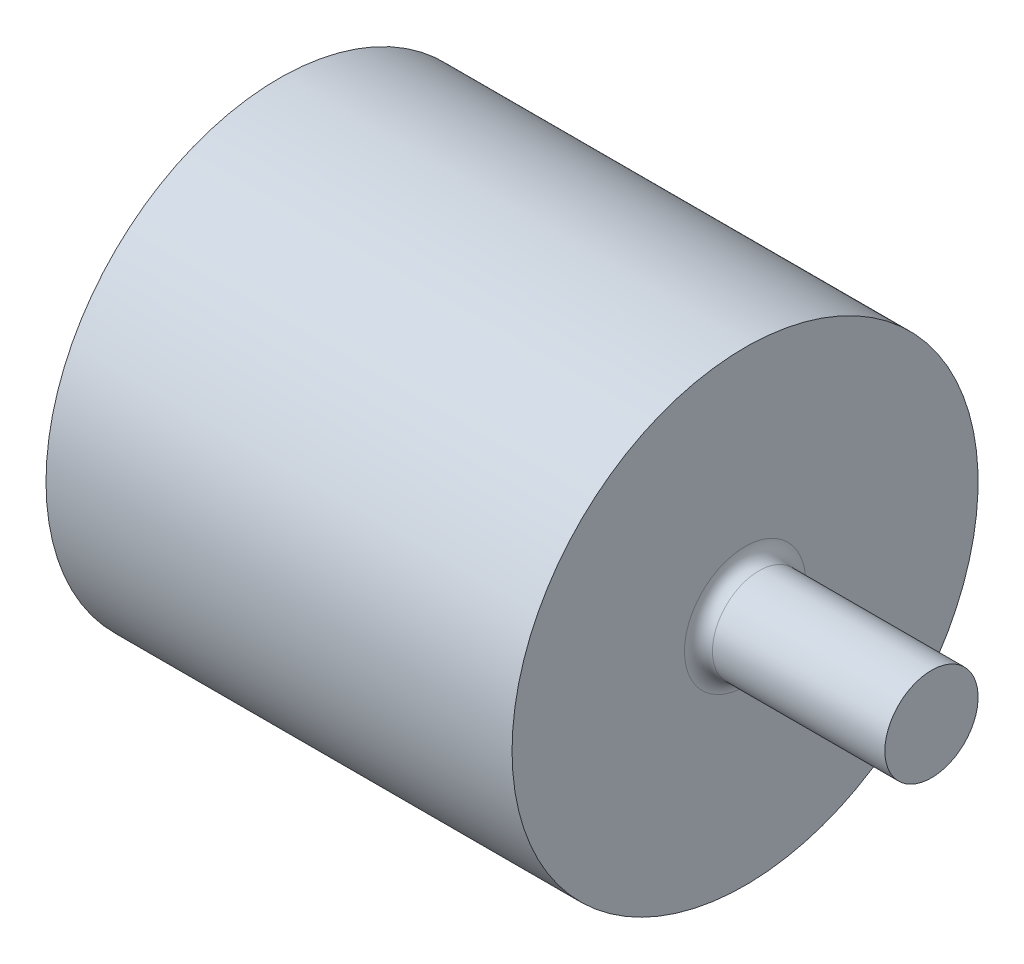
ISO-10303-21;
HEADER;
FILE_DESCRIPTION(('STEP AP214'),'2;1');
FILE_NAME('part.step','',(''),(''),'','','');
FILE_SCHEMA(('AUTOMOTIVE_DESIGN { 1 0 10303 214 1 1 1 1 }'));
ENDSEC;
DATA;
#1=APPLICATION_CONTEXT('core data for automotive mechanical design processes');
#2=APPLICATION_PROTOCOL_DEFINITION('international standard','automotive_design',2000,#1);
#3=PRODUCT_CONTEXT('',#1,'mechanical');
#4=PRODUCT('Part','Part','',(#3));
#5=PRODUCT_RELATED_PRODUCT_CATEGORY('part','',(#4));
#6=PRODUCT_DEFINITION_FORMATION('','',#4);
#7=PRODUCT_DEFINITION_CONTEXT('part definition',#1,'design');
#8=PRODUCT_DEFINITION('design','',#6,#7);
#9=PRODUCT_DEFINITION_SHAPE('','',#8);
#10=(LENGTH_UNIT() NAMED_UNIT(*) SI_UNIT(.MILLI.,.METRE.));
#11=(NAMED_UNIT(*) PLANE_ANGLE_UNIT() SI_UNIT($,.RADIAN.));
#12=(NAMED_UNIT(*) SI_UNIT($,.STERADIAN.) SOLID_ANGLE_UNIT());
#13=UNCERTAINTY_MEASURE_WITH_UNIT(LENGTH_MEASURE(1.E-05),#10,'distance_accuracy_value','');
#14=(GEOMETRIC_REPRESENTATION_CONTEXT(3) GLOBAL_UNCERTAINTY_ASSIGNED_CONTEXT((#13)) GLOBAL_UNIT_ASSIGNED_CONTEXT((#10,
#11,#12)) REPRESENTATION_CONTEXT('',''));
#15=CARTESIAN_POINT('',(0.,0.,0.));
#16=DIRECTION('',(0.,0.,1.));
#17=DIRECTION('',(1.,0.,0.));
#18=AXIS2_PLACEMENT_3D('',#15,#16,#17);
#19=CARTESIAN_POINT('',(9.00653840002022,0.,0.));
#20=DIRECTION('',(-1.,0.,0.));
#21=DIRECTION('',(0.,0.,1.));
#22=AXIS2_PLACEMENT_3D('',#19,#20,#21);
#23=PLANE('',#22);
#24=CARTESIAN_POINT('',(9.00653840002022,0.,0.));
#25=DIRECTION('',(-1.,0.,0.));
#26=DIRECTION('',(0.,0.,1.));
#27=AXIS2_PLACEMENT_3D('',#24,#25,#26);
#28=CIRCLE('',#27,1.);
#29=CARTESIAN_POINT('',(9.00653840002022,0.,1.));
#30=VERTEX_POINT('',#29);
#31=EDGE_CURVE('E63',#30,#30,#28,.T.);
#32=ORIENTED_EDGE('',*,*,#31,.F.);
#33=EDGE_LOOP('',(#32));
#34=FACE_BOUND('',#33,.T.);
#35=ADVANCED_FACE('F49',(#34),#23,.F.);
#36=CARTESIAN_POINT('',(-0.00652132208277213,0.,0.));
#37=DIRECTION('',(-1.,0.,0.));
#38=DIRECTION('',(0.,0.,1.));
#39=AXIS2_PLACEMENT_3D('',#36,#37,#38);
#40=CYLINDRICAL_SURFACE('',#39,1.);
#41=CARTESIAN_POINT('',(5.30653840002022,0.,0.));
#42=DIRECTION('',(-1.,0.,0.));
#43=DIRECTION('',(0.,0.,1.));
#44=AXIS2_PLACEMENT_3D('',#41,#42,#43);
#45=CIRCLE('',#44,1.);
#46=CARTESIAN_POINT('',(5.30653840002022,0.,1.));
#47=VERTEX_POINT('',#46);
#48=EDGE_CURVE('E12',#47,#47,#45,.F.);
#49=ORIENTED_EDGE('',*,*,#48,.T.);
#50=EDGE_LOOP('',(#49));
#51=FACE_BOUND('',#50,.T.);
#52=ORIENTED_EDGE('',*,*,#31,.T.);
#53=EDGE_LOOP('',(#52));
#54=FACE_BOUND('',#53,.T.);
#55=ADVANCED_FACE('F91',(#51,#54),#40,.T.);
#56=CARTESIAN_POINT('',(5.00653840002022,5.,0.));
#57=DIRECTION('',(-1.,0.,0.));
#58=DIRECTION('',(0.,0.,1.));
#59=AXIS2_PLACEMENT_3D('',#56,#57,#58);
#60=PLANE('',#59);
#61=CARTESIAN_POINT('',(5.00653840002022,0.,0.));
#62=DIRECTION('',(-1.,0.,0.));
#63=DIRECTION('',(0.,0.,1.));
#64=AXIS2_PLACEMENT_3D('',#61,#62,#63);
#65=CIRCLE('',#64,1.3);
#66=CARTESIAN_POINT('',(5.00653840002022,0.,1.3));
#67=VERTEX_POINT('',#66);
#68=EDGE_CURVE('E57',#67,#67,#65,.T.);
#69=ORIENTED_EDGE('',*,*,#68,.T.);
#70=EDGE_LOOP('',(#69));
#71=FACE_BOUND('',#70,.T.);
#72=CARTESIAN_POINT('',(5.00653840002022,0.,0.));
#73=DIRECTION('',(-1.,0.,0.));
#74=DIRECTION('',(0.,0.,1.));
#75=AXIS2_PLACEMENT_3D('',#72,#73,#74);
#76=CIRCLE('',#75,5.);
#77=CARTESIAN_POINT('',(5.00653840002022,0.,5.));
#78=VERTEX_POINT('',#77);
#79=EDGE_CURVE('E69',#78,#78,#76,.T.);
#80=ORIENTED_EDGE('',*,*,#79,.F.);
#81=EDGE_LOOP('',(#80));
#82=FACE_BOUND('',#81,.T.);
#83=ADVANCED_FACE('F86',(#71,#82),#60,.F.);
#84=CARTESIAN_POINT('',(-0.00652132208277213,0.,0.));
#85=DIRECTION('',(-1.,0.,0.));
#86=DIRECTION('',(0.,0.,1.));
#87=AXIS2_PLACEMENT_3D('',#84,#85,#86);
#88=CYLINDRICAL_SURFACE('',#87,5.);
#89=CARTESIAN_POINT('',(-4.99346159997978,0.,0.));
#90=DIRECTION('',(-1.,0.,0.));
#91=DIRECTION('',(0.,0.,1.));
#92=AXIS2_PLACEMENT_3D('',#89,#90,#91);
#93=CIRCLE('',#92,5.);
#94=CARTESIAN_POINT('',(-4.99346159997978,0.,5.));
#95=VERTEX_POINT('',#94);
#96=EDGE_CURVE('E75',#95,#95,#93,.T.);
#97=ORIENTED_EDGE('',*,*,#96,.F.);
#98=EDGE_LOOP('',(#97));
#99=FACE_BOUND('',#98,.T.);
#100=ORIENTED_EDGE('',*,*,#79,.T.);
#101=EDGE_LOOP('',(#100));
#102=FACE_BOUND('',#101,.T.);
#103=ADVANCED_FACE('F83',(#99,#102),#88,.T.);
#104=CARTESIAN_POINT('',(-4.99346159997978,5.,0.));
#105=DIRECTION('',(1.,0.,0.));
#106=DIRECTION('',(0.,0.,-1.));
#107=AXIS2_PLACEMENT_3D('',#104,#105,#106);
#108=PLANE('',#107);
#109=ORIENTED_EDGE('',*,*,#96,.T.);
#110=EDGE_LOOP('',(#109));
#111=FACE_BOUND('',#110,.T.);
#112=ADVANCED_FACE('F81',(#111),#108,.F.);
#113=CARTESIAN_POINT('',(5.30653840002022,0.,0.));
#114=DIRECTION('',(-1.,0.,0.));
#115=DIRECTION('',(0.,0.,1.));
#116=AXIS2_PLACEMENT_3D('',#113,#114,#115);
#117=TOROIDAL_SURFACE('',#116,1.3,0.3);
#118=ORIENTED_EDGE('',*,*,#48,.F.);
#119=EDGE_LOOP('',(#118));
#120=FACE_BOUND('',#119,.T.);
#121=ORIENTED_EDGE('',*,*,#68,.F.);
#122=EDGE_LOOP('',(#121));
#123=FACE_BOUND('',#122,.T.);
#124=ADVANCED_FACE('F51',(#120,#123),#117,.F.);
#125=CLOSED_SHELL('',(#35,#55,#83,#103,#112,#124));
#126=MANIFOLD_SOLID_BREP('B2',#125);
#127=ADVANCED_BREP_SHAPE_REPRESENTATION('',(#18,#126),#14);
#128=SHAPE_DEFINITION_REPRESENTATION(#9,#127);
ENDSEC;
END-ISO-10303-21;
